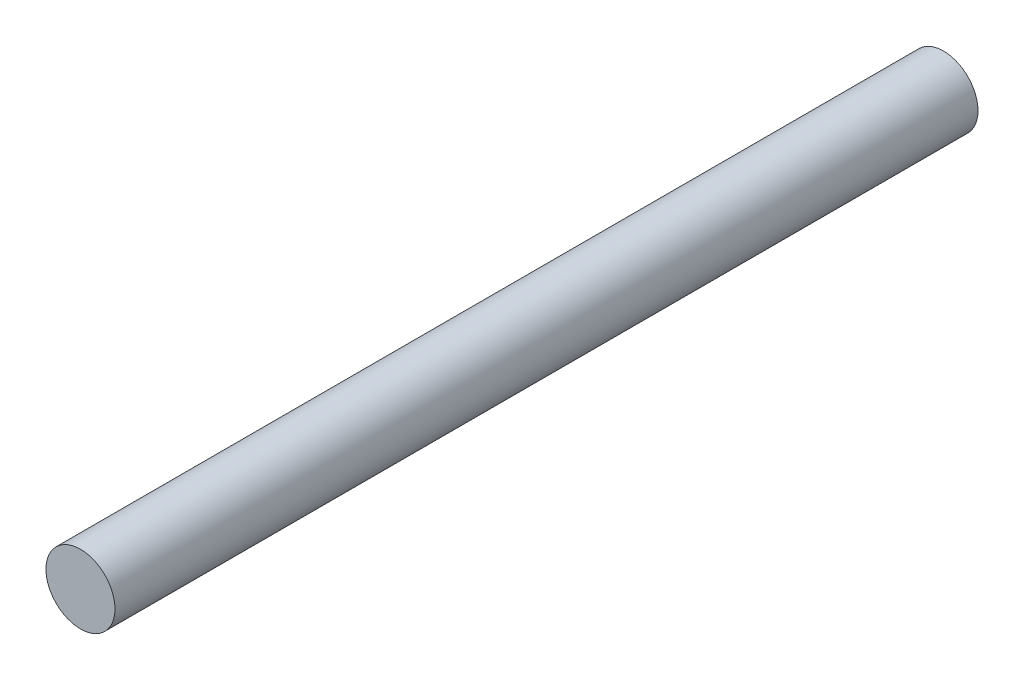
ISO-10303-21;
HEADER;
FILE_DESCRIPTION(('STEP AP214'),'2;1');
FILE_NAME('part.step','',(''),(''),'','','');
FILE_SCHEMA(('AUTOMOTIVE_DESIGN { 1 0 10303 214 1 1 1 1 }'));
ENDSEC;
DATA;
#1=APPLICATION_CONTEXT('core data for automotive mechanical design processes');
#2=APPLICATION_PROTOCOL_DEFINITION('international standard','automotive_design',2000,#1);
#3=PRODUCT_CONTEXT('',#1,'mechanical');
#4=PRODUCT('Part','Part','',(#3));
#5=PRODUCT_RELATED_PRODUCT_CATEGORY('part','',(#4));
#6=PRODUCT_DEFINITION_FORMATION('','',#4);
#7=PRODUCT_DEFINITION_CONTEXT('part definition',#1,'design');
#8=PRODUCT_DEFINITION('design','',#6,#7);
#9=PRODUCT_DEFINITION_SHAPE('','',#8);
#10=(LENGTH_UNIT() NAMED_UNIT(*) SI_UNIT(.MILLI.,.METRE.));
#11=(NAMED_UNIT(*) PLANE_ANGLE_UNIT() SI_UNIT($,.RADIAN.));
#12=(NAMED_UNIT(*) SI_UNIT($,.STERADIAN.) SOLID_ANGLE_UNIT());
#13=UNCERTAINTY_MEASURE_WITH_UNIT(LENGTH_MEASURE(1.E-05),#10,'distance_accuracy_value','');
#14=(GEOMETRIC_REPRESENTATION_CONTEXT(3) GLOBAL_UNCERTAINTY_ASSIGNED_CONTEXT((#13)) GLOBAL_UNIT_ASSIGNED_CONTEXT((#10,
#11,#12)) REPRESENTATION_CONTEXT('',''));
#15=CARTESIAN_POINT('',(0.,0.,0.));
#16=DIRECTION('',(0.,0.,1.));
#17=DIRECTION('',(1.,0.,0.));
#18=AXIS2_PLACEMENT_3D('',#15,#16,#17);
#19=CARTESIAN_POINT('',(0.,0.,100.));
#20=DIRECTION('',(0.,0.,-1.));
#21=DIRECTION('',(-1.,0.,0.));
#22=AXIS2_PLACEMENT_3D('',#19,#20,#21);
#23=CYLINDRICAL_SURFACE('',#22,4.);
#24=CARTESIAN_POINT('',(0.,0.,100.));
#25=DIRECTION('',(0.,0.,1.));
#26=DIRECTION('',(1.,0.,0.));
#27=AXIS2_PLACEMENT_3D('',#24,#25,#26);
#28=CIRCLE('',#27,4.);
#29=CARTESIAN_POINT('',(4.,0.,100.));
#30=VERTEX_POINT('',#29);
#31=EDGE_CURVE('E10',#30,#30,#28,.T.);
#32=ORIENTED_EDGE('',*,*,#31,.F.);
#33=EDGE_LOOP('',(#32));
#34=FACE_BOUND('',#33,.T.);
#35=CARTESIAN_POINT('',(0.,0.,0.));
#36=DIRECTION('',(0.,0.,1.));
#37=DIRECTION('',(1.,0.,0.));
#38=AXIS2_PLACEMENT_3D('',#35,#36,#37);
#39=CIRCLE('',#38,4.);
#40=CARTESIAN_POINT('',(4.,0.,0.));
#41=VERTEX_POINT('',#40);
#42=EDGE_CURVE('E50',#41,#41,#39,.T.);
#43=ORIENTED_EDGE('',*,*,#42,.T.);
#44=EDGE_LOOP('',(#43));
#45=FACE_BOUND('',#44,.T.);
#46=ADVANCED_FACE('F47',(#34,#45),#23,.T.);
#47=CARTESIAN_POINT('',(0.,0.,100.));
#48=DIRECTION('',(0.,0.,1.));
#49=DIRECTION('',(1.,0.,0.));
#50=AXIS2_PLACEMENT_3D('',#47,#48,#49);
#51=PLANE('',#50);
#52=ORIENTED_EDGE('',*,*,#31,.T.);
#53=EDGE_LOOP('',(#52));
#54=FACE_BOUND('',#53,.T.);
#55=ADVANCED_FACE('F66',(#54),#51,.T.);
#56=CARTESIAN_POINT('',(0.,0.,0.));
#57=DIRECTION('',(0.,0.,1.));
#58=DIRECTION('',(1.,0.,0.));
#59=AXIS2_PLACEMENT_3D('',#56,#57,#58);
#60=PLANE('',#59);
#61=ORIENTED_EDGE('',*,*,#42,.F.);
#62=EDGE_LOOP('',(#61));
#63=FACE_BOUND('',#62,.T.);
#64=ADVANCED_FACE('F64',(#63),#60,.F.);
#65=CLOSED_SHELL('',(#46,#55,#64));
#66=MANIFOLD_SOLID_BREP('B2',#65);
#67=ADVANCED_BREP_SHAPE_REPRESENTATION('',(#18,#66),#14);
#68=SHAPE_DEFINITION_REPRESENTATION(#9,#67);
ENDSEC;
END-ISO-10303-21;
